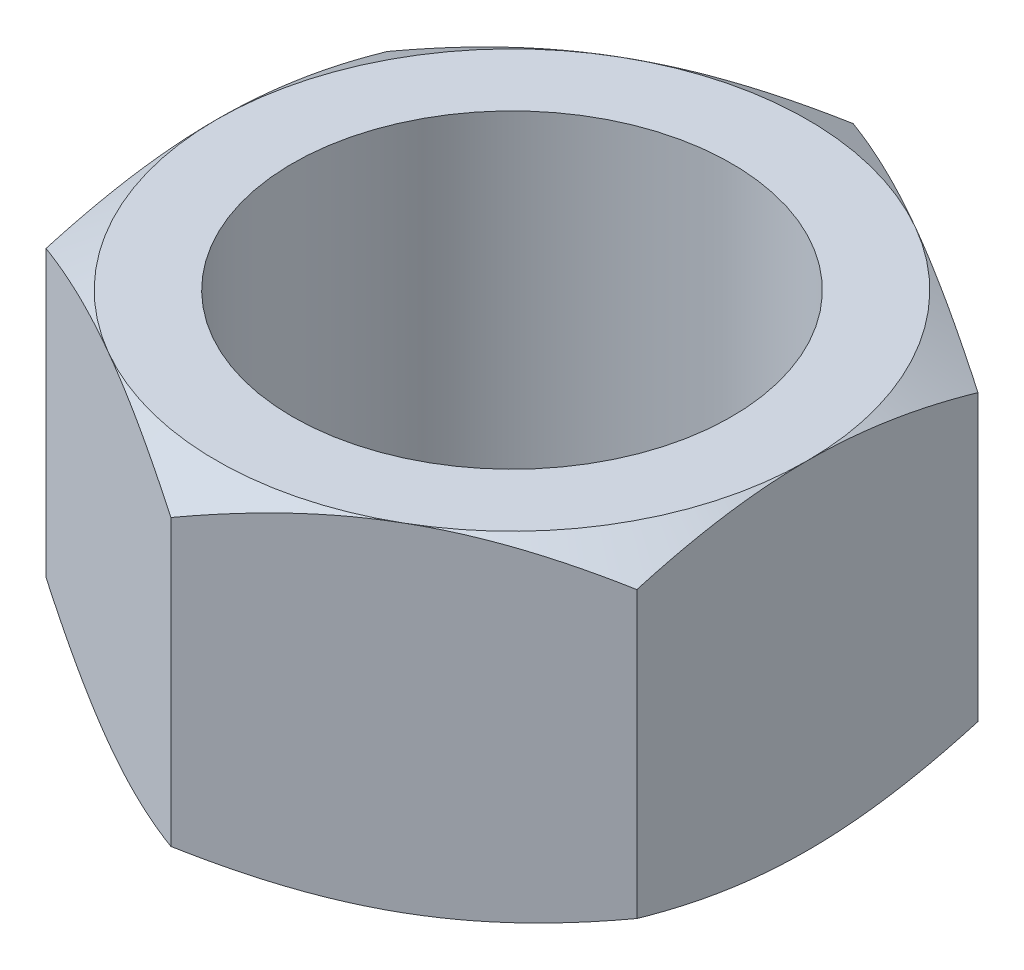
ISO-10303-21;
HEADER;
FILE_DESCRIPTION(('STEP AP214'),'2;1');
FILE_NAME('part.step','',(''),(''),'','','');
FILE_SCHEMA(('AUTOMOTIVE_DESIGN { 1 0 10303 214 1 1 1 1 }'));
ENDSEC;
DATA;
#1=APPLICATION_CONTEXT('core data for automotive mechanical design processes');
#2=APPLICATION_PROTOCOL_DEFINITION('international standard','automotive_design',2000,#1);
#3=PRODUCT_CONTEXT('',#1,'mechanical');
#4=PRODUCT('Part','Part','',(#3));
#5=PRODUCT_RELATED_PRODUCT_CATEGORY('part','',(#4));
#6=PRODUCT_DEFINITION_FORMATION('','',#4);
#7=PRODUCT_DEFINITION_CONTEXT('part definition',#1,'design');
#8=PRODUCT_DEFINITION('design','',#6,#7);
#9=PRODUCT_DEFINITION_SHAPE('','',#8);
#10=(LENGTH_UNIT() NAMED_UNIT(*) SI_UNIT(.MILLI.,.METRE.));
#11=(NAMED_UNIT(*) PLANE_ANGLE_UNIT() SI_UNIT($,.RADIAN.));
#12=(NAMED_UNIT(*) SI_UNIT($,.STERADIAN.) SOLID_ANGLE_UNIT());
#13=UNCERTAINTY_MEASURE_WITH_UNIT(LENGTH_MEASURE(1.E-05),#10,'distance_accuracy_value','');
#14=(GEOMETRIC_REPRESENTATION_CONTEXT(3) GLOBAL_UNCERTAINTY_ASSIGNED_CONTEXT((#13)) GLOBAL_UNIT_ASSIGNED_CONTEXT((#10,
#11,#12)) REPRESENTATION_CONTEXT('',''));
#15=CARTESIAN_POINT('',(0.,0.,0.));
#16=DIRECTION('',(0.,0.,1.));
#17=DIRECTION('',(1.,0.,0.));
#18=AXIS2_PLACEMENT_3D('',#15,#16,#17);
#19=CARTESIAN_POINT('',(4.44499999999997,2.54,-2.56632194654794));
#20=DIRECTION('',(-0.499999999999995,0.,0.866025403784441));
#21=DIRECTION('',(0.866025403784441,0.,0.499999999999995));
#22=AXIS2_PLACEMENT_3D('',#19,#20,#21);
#23=PLANE('',#22);
#24=CARTESIAN_POINT('',(-0.0002,-2.14292194429822,-5.13275936314961));
#25=CARTESIAN_POINT('',(0.195134205292003,-2.20805657093736,-5.01998310714234));
#26=CARTESIAN_POINT('',(0.39215452522148,-2.2672939412632,-4.90623337239523));
#27=CARTESIAN_POINT('',(0.789606715262491,-2.37069291144292,-4.67676424348505));
#28=CARTESIAN_POINT('',(0.990045647069465,-2.41481793333261,-4.56104077225021));
#29=CARTESIAN_POINT('',(1.38843947013211,-2.48350433724155,-4.33102799126151));
#30=CARTESIAN_POINT('',(1.58633306681894,-2.50852287412247,-4.21677406994347));
#31=CARTESIAN_POINT('',(1.98305132586114,-2.53838874032065,-3.98772867629302));
#32=CARTESIAN_POINT('',(2.18187454643839,-2.54326080228227,-3.8729380363716));
#33=CARTESIAN_POINT('',(2.55338076605085,-2.53312038077342,-3.65844882047272));
#34=CARTESIAN_POINT('',(2.72611940331296,-2.52059771326113,-3.55871812175));
#35=CARTESIAN_POINT('',(3.07047129711104,-2.48090971292823,-3.35990646316972));
#36=CARTESIAN_POINT('',(3.24208336277185,-2.45373082512862,-3.26082619086427));
#37=CARTESIAN_POINT('',(3.58714513426501,-2.38578630030974,-3.06160468420564));
#38=CARTESIAN_POINT('',(3.76055117129309,-2.34473267413266,-2.96148866204837));
#39=CARTESIAN_POINT('',(4.10477706620055,-2.25155731393392,-2.76274974896152));
#40=CARTESIAN_POINT('',(4.27560133346985,-2.19945747021142,-2.66412431226947));
#41=CARTESIAN_POINT('',(4.44519999999997,-2.14292194429822,-2.5662064764941));
#42=B_SPLINE_CURVE_WITH_KNOTS('',3,(#24,#25,#26,#27,#28,#29,#30,#31,#32,#33,#34,#35,#36,#37,#38,
#39,#40,#41),.UNSPECIFIED.,.F.,.F.,(4,2,2,2,2,2,2,2,4),(0.,0.704583898211653,1.41086131642101,
2.09965901433262,2.78761086425163,3.38660323540636,3.98615054427457,4.59899609230844,
5.21063832934908),.UNSPECIFIED.);
#43=CARTESIAN_POINT('',(0.,-2.14298861321455,-5.13264389309578));
#44=VERTEX_POINT('',#43);
#45=CARTESIAN_POINT('',(2.22249999999998,-2.54,-3.84948291982184));
#46=VERTEX_POINT('',#45);
#47=EDGE_CURVE('E64',#44,#46,#42,.T.);
#48=ORIENTED_EDGE('',*,*,#47,.F.);
#49=DIRECTION('',(0.,-1.,0.));
#50=VECTOR('',#49,1.);
#51=CARTESIAN_POINT('',(0.,2.54,-5.13264389309578));
#52=LINE('',#51,#50);
#53=CARTESIAN_POINT('',(0.,2.14298861321456,-5.13264389309578));
#54=VERTEX_POINT('',#53);
#55=EDGE_CURVE('E300',#54,#44,#52,.T.);
#56=ORIENTED_EDGE('',*,*,#55,.F.);
#57=CARTESIAN_POINT('',(4.44519999999997,2.14292194429822,-2.5662064764941));
#58=CARTESIAN_POINT('',(4.24986579470797,2.20805657093736,-2.67898273250138));
#59=CARTESIAN_POINT('',(4.05284547477849,2.2672939412632,-2.79273246724849));
#60=CARTESIAN_POINT('',(3.65539328473748,2.37069291144292,-3.02220159615867));
#61=CARTESIAN_POINT('',(3.45495435293051,2.41481793333261,-3.1379250673935));
#62=CARTESIAN_POINT('',(3.05656052986786,2.48350433724155,-3.36793784838221));
#63=CARTESIAN_POINT('',(2.85866693318103,2.50852287412248,-3.48219176970025));
#64=CARTESIAN_POINT('',(2.46194867413884,2.53838874032065,-3.71123716335069));
#65=CARTESIAN_POINT('',(2.26312545356158,2.54326080228227,-3.82602780327212));
#66=CARTESIAN_POINT('',(1.89161923394912,2.53312038077342,-4.04051701917099));
#67=CARTESIAN_POINT('',(1.71888059668701,2.52059771326113,-4.14024771789372));
#68=CARTESIAN_POINT('',(1.37452870288893,2.48090971292823,-4.339059376474));
#69=CARTESIAN_POINT('',(1.20291663722813,2.45373082512862,-4.43813964877945));
#70=CARTESIAN_POINT('',(0.857854865734964,2.38578630030974,-4.63736115543807));
#71=CARTESIAN_POINT('',(0.684448828706879,2.34473267413266,-4.73747717759534));
#72=CARTESIAN_POINT('',(0.340222933799419,2.25155731393392,-4.9362160906822));
#73=CARTESIAN_POINT('',(0.169398666530117,2.19945747021142,-5.03484152737425));
#74=CARTESIAN_POINT('',(-0.000199999999999549,2.14292194429822,-5.13275936314961));
#75=B_SPLINE_CURVE_WITH_KNOTS('',3,(#57,#58,#59,#60,#61,#62,#63,#64,#65,#66,#67,#68,#69,#70,#71,
#72,#73,#74),.UNSPECIFIED.,.F.,.F.,(4,2,2,2,2,2,2,2,4),(0.,0.704583898211653,1.41086131642101,
2.09965901433262,2.78761086425163,3.38660323540636,3.98615054427457,4.59899609230844,
5.21063832934908),.UNSPECIFIED.);
#76=CARTESIAN_POINT('',(2.22249999999999,2.54,-3.84948291982186));
#77=VERTEX_POINT('',#76);
#78=EDGE_CURVE('E270',#77,#54,#75,.T.);
#79=ORIENTED_EDGE('',*,*,#78,.F.);
#80=CARTESIAN_POINT('',(4.44499999999997,2.14298861321456,-2.56632194654794));
#81=VERTEX_POINT('',#80);
#82=EDGE_CURVE('E344',#81,#77,#75,.T.);
#83=ORIENTED_EDGE('',*,*,#82,.F.);
#84=DIRECTION('',(0.,-1.,0.));
#85=VECTOR('',#84,1.);
#86=CARTESIAN_POINT('',(4.44499999999997,2.54,-2.56632194654794));
#87=LINE('',#86,#85);
#88=CARTESIAN_POINT('',(4.44499999999997,-2.14298861321455,-2.56632194654794));
#89=VERTEX_POINT('',#88);
#90=EDGE_CURVE('E348',#81,#89,#87,.T.);
#91=ORIENTED_EDGE('',*,*,#90,.T.);
#92=EDGE_CURVE('E150',#46,#89,#42,.T.);
#93=ORIENTED_EDGE('',*,*,#92,.F.);
#94=EDGE_LOOP('',(#48,#56,#79,#83,#91,#93));
#95=FACE_BOUND('',#94,.T.);
#96=ADVANCED_FACE('F47',(#95),#23,.F.);
#97=CARTESIAN_POINT('',(0.,2.54,-5.13264389309578));
#98=DIRECTION('',(0.500000000000001,0.,0.866025403784438));
#99=DIRECTION('',(0.866025403784438,0.,-0.500000000000001));
#100=AXIS2_PLACEMENT_3D('',#97,#98,#99);
#101=PLANE('',#100);
#102=CARTESIAN_POINT('',(-4.44520000000001,-2.14292194429822,-2.56620647649404));
#103=CARTESIAN_POINT('',(-4.24986579470801,-2.20805657093736,-2.67898273250132));
#104=CARTESIAN_POINT('',(-4.05284547477853,-2.2672939412632,-2.79273246724843));
#105=CARTESIAN_POINT('',(-3.65539328473752,-2.37069291144292,-3.02220159615861));
#106=CARTESIAN_POINT('',(-3.45495435293055,-2.41481793333262,-3.13792506739345));
#107=CARTESIAN_POINT('',(-3.0565605298679,-2.48350433724155,-3.36793784838215));
#108=CARTESIAN_POINT('',(-2.85866693318107,-2.50852287412248,-3.4821917697002));
#109=CARTESIAN_POINT('',(-2.46194867413888,-2.53838874032066,-3.71123716335065));
#110=CARTESIAN_POINT('',(-2.26312545356163,-2.54326080228228,-3.82602780327207));
#111=CARTESIAN_POINT('',(-1.89161923394916,-2.53312038077343,-4.04051701917095));
#112=CARTESIAN_POINT('',(-1.71888059668705,-2.52059771326114,-4.14024771789368));
#113=CARTESIAN_POINT('',(-1.37452870288896,-2.48090971292824,-4.33905937647397));
#114=CARTESIAN_POINT('',(-1.20291663722815,-2.45373082512863,-4.43813964877942));
#115=CARTESIAN_POINT('',(-0.857854865734983,-2.38578630030975,-4.63736115543805));
#116=CARTESIAN_POINT('',(-0.684448828706893,-2.34473267413267,-4.73747717759533));
#117=CARTESIAN_POINT('',(-0.340222933799426,-2.25155731393393,-4.93621609068219));
#118=CARTESIAN_POINT('',(-0.169398666530121,-2.19945747021142,-5.03484152737425));
#119=CARTESIAN_POINT('',(0.000199999999999846,-2.14292194429822,-5.13275936314961));
#120=B_SPLINE_CURVE_WITH_KNOTS('',3,(#102,#103,#104,#105,#106,#107,#108,#109,#110,#111,#112,
#113,#114,#115,#116,#117,#118,#119),.UNSPECIFIED.,.F.,.F.,(4,2,2,2,2,2,2,2,4),(0.,
0.704583898211653,1.41086131642101,2.09965901433262,2.78761086425163,3.38660323540637,
3.9861505442746,4.59899609230849,5.21063832934914),.UNSPECIFIED.);
#121=CARTESIAN_POINT('',(-4.44500000000001,-2.14298861321455,-2.56632194654788));
#122=VERTEX_POINT('',#121);
#123=CARTESIAN_POINT('',(-2.2225,-2.54,-3.84948291982183));
#124=VERTEX_POINT('',#123);
#125=EDGE_CURVE('E72',#122,#124,#120,.T.);
#126=ORIENTED_EDGE('',*,*,#125,.F.);
#127=DIRECTION('',(0.,-1.,0.));
#128=VECTOR('',#127,1.);
#129=CARTESIAN_POINT('',(-4.44500000000001,2.54,-2.56632194654788));
#130=LINE('',#129,#128);
#131=CARTESIAN_POINT('',(-4.44500000000001,2.14298861321456,-2.56632194654788));
#132=VERTEX_POINT('',#131);
#133=EDGE_CURVE('E291',#132,#122,#130,.T.);
#134=ORIENTED_EDGE('',*,*,#133,.F.);
#135=CARTESIAN_POINT('',(0.000200000000000009,2.14292194429822,-5.13275936314961));
#136=CARTESIAN_POINT('',(-0.195134205292002,2.20805657093736,-5.01998310714234));
#137=CARTESIAN_POINT('',(-0.392154525221478,2.2672939412632,-4.90623337239523));
#138=CARTESIAN_POINT('',(-0.789606715262487,2.37069291144293,-4.67676424348504));
#139=CARTESIAN_POINT('',(-0.99004564706946,2.41481793333262,-4.5610407722502));
#140=CARTESIAN_POINT('',(-1.38843947013211,2.48350433724155,-4.3310279912615));
#141=CARTESIAN_POINT('',(-1.58633306681894,2.50852287412248,-4.21677406994346));
#142=CARTESIAN_POINT('',(-1.98305132586113,2.53838874032066,-3.98772867629301));
#143=CARTESIAN_POINT('',(-2.18187454643838,2.54326080228228,-3.87293803637158));
#144=CARTESIAN_POINT('',(-2.55338076605084,2.53312038077344,-3.6584488204727));
#145=CARTESIAN_POINT('',(-2.72611940331296,2.52059771326115,-3.55871812174997));
#146=CARTESIAN_POINT('',(-3.07047129711105,2.48090971292824,-3.35990646316969));
#147=CARTESIAN_POINT('',(-3.24208336277185,2.45373082512863,-3.26082619086423));
#148=CARTESIAN_POINT('',(-3.58714513426502,2.38578630030975,-3.0616046842056));
#149=CARTESIAN_POINT('',(-3.76055117129311,2.34473267413267,-2.96148866204833));
#150=CARTESIAN_POINT('',(-4.10477706620058,2.25155731393393,-2.76274974896146));
#151=CARTESIAN_POINT('',(-4.27560133346989,2.19945747021143,-2.66412431226941));
#152=CARTESIAN_POINT('',(-4.44520000000001,2.14292194429822,-2.56620647649404));
#153=B_SPLINE_CURVE_WITH_KNOTS('',3,(#135,#136,#137,#138,#139,#140,#141,#142,#143,#144,#145,
#146,#147,#148,#149,#150,#151,#152),.UNSPECIFIED.,.F.,.F.,(4,2,2,2,2,2,2,2,4),(0.,
0.704583898211653,1.41086131642101,2.09965901433262,2.78761086425163,3.38660323540637,
3.9861505442746,4.59899609230849,5.21063832934914),.UNSPECIFIED.);
#154=CARTESIAN_POINT('',(-2.22250000000001,2.54,-3.84948291982183));
#155=VERTEX_POINT('',#154);
#156=EDGE_CURVE('E262',#155,#132,#153,.T.);
#157=ORIENTED_EDGE('',*,*,#156,.F.);
#158=EDGE_CURVE('E269',#54,#155,#153,.T.);
#159=ORIENTED_EDGE('',*,*,#158,.F.);
#160=ORIENTED_EDGE('',*,*,#55,.T.);
#161=EDGE_CURVE('E177',#124,#44,#120,.T.);
#162=ORIENTED_EDGE('',*,*,#161,.F.);
#163=EDGE_LOOP('',(#126,#134,#157,#159,#160,#162));
#164=FACE_BOUND('',#163,.T.);
#165=ADVANCED_FACE('F276',(#164),#101,.F.);
#166=CARTESIAN_POINT('',(-4.44500000000001,2.54,-2.56632194654788));
#167=DIRECTION('',(1.,0.,0.));
#168=DIRECTION('',(0.,0.,-1.));
#169=AXIS2_PLACEMENT_3D('',#166,#167,#168);
#170=PLANE('',#169);
#171=CARTESIAN_POINT('',(-4.44499999999997,0.913793553764367,9.43225036305231));
#172=CARTESIAN_POINT('',(-4.44499999999997,0.799939464876857,9.21422222232649));
#173=CARTESIAN_POINT('',(-4.44499999999997,0.686627140735543,8.99590893694942));
#174=CARTESIAN_POINT('',(-4.44499999999997,0.461361050932911,8.55857151988885));
#175=CARTESIAN_POINT('',(-4.44499999999997,0.349407341607161,8.33954735920264));
#176=CARTESIAN_POINT('',(-4.44499999999997,0.126979863125517,7.9003435695982));
#177=CARTESIAN_POINT('',(-4.44499999999998,0.0165085071575138,7.68016271663265));
#178=CARTESIAN_POINT('',(-4.44499999999998,-0.202398705212406,7.23879398225194));
#179=CARTESIAN_POINT('',(-4.44499999999998,-0.310834590773044,7.01760611531904));
#180=CARTESIAN_POINT('',(-4.44499999999998,-0.531229787322068,6.56146713388194));
#181=CARTESIAN_POINT('',(-4.44499999999998,-0.643041856033312,6.32644469047433));
#182=CARTESIAN_POINT('',(-4.44499999999998,-0.863040494433211,5.85471049641598));
#183=CARTESIAN_POINT('',(-4.44499999999998,-0.971227149117539,5.61799878552715));
#184=CARTESIAN_POINT('',(-4.44499999999998,-1.18283489632335,5.14258317678226));
#185=CARTESIAN_POINT('',(-4.44499999999998,-1.28625830016106,4.90388031296646));
#186=CARTESIAN_POINT('',(-4.44499999999999,-1.48686883477101,4.42388087539127));
#187=CARTESIAN_POINT('',(-4.44499999999999,-1.58405654672986,4.18258454580586));
#188=CARTESIAN_POINT('',(-4.44499999999999,-1.78084193214056,3.66873426469667));
#189=CARTESIAN_POINT('',(-4.44499999999999,-1.8794239427643,3.39578596515785));
#190=CARTESIAN_POINT('',(-4.44499999999999,-2.06214356003189,2.84497498911751));
#191=CARTESIAN_POINT('',(-4.44499999999999,-2.1462788796667,2.56711154218044));
#192=CARTESIAN_POINT('',(-4.44499999999999,-2.29293585486918,2.0116862938217));
#193=CARTESIAN_POINT('',(-4.44499999999999,-2.35586873274095,1.73423723011392));
#194=CARTESIAN_POINT('',(-4.445,-2.43120349492402,1.31469921034627));
#195=CARTESIAN_POINT('',(-4.445,-2.45313637580591,1.17430713518012));
#196=CARTESIAN_POINT('',(-4.445,-2.48996434819672,0.892612224475861));
#197=CARTESIAN_POINT('',(-4.445,-2.50486063425895,0.751309547655693));
#198=CARTESIAN_POINT('',(-4.445,-2.52727959876194,0.465555537823025));
#199=CARTESIAN_POINT('',(-4.445,-2.53466480236686,0.321093292334108));
#200=CARTESIAN_POINT('',(-4.445,-2.54128879275954,0.0319812773758228));
#201=CARTESIAN_POINT('',(-4.445,-2.54052763417278,-0.112668490829607));
#202=CARTESIAN_POINT('',(-4.445,-2.53088783566023,-0.401713765202345));
#203=CARTESIAN_POINT('',(-4.445,-2.52200822574437,-0.546109238921059));
#204=CARTESIAN_POINT('',(-4.445,-2.49649313483877,-0.834198678180961));
#205=CARTESIAN_POINT('',(-4.445,-2.47985743787404,-0.9778926240749));
#206=CARTESIAN_POINT('',(-4.445,-2.41832310581975,-1.41360737399661));
#207=CARTESIAN_POINT('',(-4.44500000000001,-2.36204122384692,-1.70406586069355));
#208=CARTESIAN_POINT('',(-4.44500000000001,-2.2602209118653,-2.13546189272902));
#209=CARTESIAN_POINT('',(-4.44500000000001,-2.22336551212094,-2.27859390746489));
#210=CARTESIAN_POINT('',(-4.44500000000001,-2.14468169228813,-2.56349565803153));
#211=CARTESIAN_POINT('',(-4.44500000000001,-2.1028532671832,-2.70526539248796));
#212=CARTESIAN_POINT('',(-4.44500000000001,-1.9663632861532,-3.14371334498779));
#213=CARTESIAN_POINT('',(-4.44500000000001,-1.86447604841242,-3.43813571248944));
#214=CARTESIAN_POINT('',(-4.44500000000001,-1.64771207452743,-4.022174103576));
#215=CARTESIAN_POINT('',(-4.44500000000001,-1.53283050448568,-4.31178829226816));
#216=CARTESIAN_POINT('',(-4.44500000000002,-1.29375704778267,-4.8876347742215));
#217=CARTESIAN_POINT('',(-4.44500000000002,-1.16955132017274,-5.17386127941992));
#218=CARTESIAN_POINT('',(-4.44500000000002,-0.914606930430404,-5.74331493687457));
#219=CARTESIAN_POINT('',(-4.44500000000002,-0.783869290415,-6.026542550045));
#220=CARTESIAN_POINT('',(-4.44500000000002,-0.526196668351576,-6.57249307029257));
#221=CARTESIAN_POINT('',(-4.44500000000002,-0.399561917038164,-6.83535826659629));
#222=CARTESIAN_POINT('',(-4.44500000000002,-0.143078804329942,-7.3595275738561));
#223=CARTESIAN_POINT('',(-4.44500000000002,-0.0132302933758102,-7.62083161145514));
#224=CARTESIAN_POINT('',(-4.44500000000003,0.248386588974361,-8.14106821825075));
#225=CARTESIAN_POINT('',(-4.44500000000003,0.380144316428684,-8.40000615273975));
#226=CARTESIAN_POINT('',(-4.44500000000003,0.645618837036986,-8.91684341347258));
#227=CARTESIAN_POINT('',(-4.44500000000003,0.77933543029397,-9.17474284231576));
#228=CARTESIAN_POINT('',(-4.44500000000003,0.913793553764366,-9.43225036305228));
#229=B_SPLINE_CURVE_WITH_KNOTS('',3,(#171,#172,#173,#174,#175,#176,#177,#178,#179,#180,#181,
#182,#183,#184,#185,#186,#187,#188,#189,#190,#191,#192,#193,#194,#195,#196,#197,#198,#199,#200,
#201,#202,#203,#204,#205,#206,#207,#208,#209,#210,#211,#212,#213,#214,#215,#216,#217,#218,#219,
#220,#221,#222,#223,#224,#225,#226,#227,#228),.UNSPECIFIED.,.F.,.F.,(4,2,2,2,2,2,2,2,2,2,2,2,2,
2,2,2,2,2,2,2,2,2,2,2,2,2,2,2,4),(0.,0.737898670351123,1.47582783416407,2.21484002208094,
2.95384161533626,3.73461045483919,4.51536097685688,5.29572856811454,6.07602332062079,
6.94634491301855,7.81680415644895,8.66925110589245,9.09538659456247,9.52144971518079,
9.95517785135082,10.3889030791563,10.8226801350915,11.2564692706476,12.1425569444736,
12.5859066800292,13.0292568628128,13.9634179036872,14.8979276029344,15.8338530320361,
16.7696324629604,17.6449395741667,18.5202874965781,19.3918749857373,20.263374142887),.UNSPECIFIED.);
#230=CARTESIAN_POINT('',(-4.44499999999999,-2.14298861321455,2.56632194654791));
#231=VERTEX_POINT('',#230);
#232=CARTESIAN_POINT('',(-4.445,-2.54,0.));
#233=VERTEX_POINT('',#232);
#234=EDGE_CURVE('E382',#231,#233,#229,.T.);
#235=ORIENTED_EDGE('',*,*,#234,.F.);
#236=DIRECTION('',(0.,-1.,0.));
#237=VECTOR('',#236,1.);
#238=CARTESIAN_POINT('',(-4.44499999999999,2.54,2.56632194654791));
#239=LINE('',#238,#237);
#240=CARTESIAN_POINT('',(-4.44499999999999,2.14298861321456,2.56632194654791));
#241=VERTEX_POINT('',#240);
#242=EDGE_CURVE('E301',#241,#231,#239,.T.);
#243=ORIENTED_EDGE('',*,*,#242,.F.);
#244=CARTESIAN_POINT('',(-4.44500000000003,-0.913793553764364,-9.43225036305228));
#245=CARTESIAN_POINT('',(-4.44500000000003,-0.799939464876854,-9.21422222232646));
#246=CARTESIAN_POINT('',(-4.44500000000003,-0.68662714073554,-8.99590893694939));
#247=CARTESIAN_POINT('',(-4.44500000000003,-0.461361050932909,-8.55857151988882));
#248=CARTESIAN_POINT('',(-4.44500000000003,-0.34940734160716,-8.33954735920261));
#249=CARTESIAN_POINT('',(-4.44500000000003,-0.126979863125515,-7.90034356959817));
#250=CARTESIAN_POINT('',(-4.44500000000002,-0.0165085071575114,-7.68016271663262));
#251=CARTESIAN_POINT('',(-4.44500000000002,0.202398705212409,-7.23879398225191));
#252=CARTESIAN_POINT('',(-4.44500000000002,0.310834590773046,-7.01760611531901));
#253=CARTESIAN_POINT('',(-4.44500000000002,0.53122978732207,-6.56146713388191));
#254=CARTESIAN_POINT('',(-4.44500000000002,0.643041856033314,-6.32644469047431));
#255=CARTESIAN_POINT('',(-4.44500000000002,0.863040494433212,-5.85471049641596));
#256=CARTESIAN_POINT('',(-4.44500000000002,0.97122714911754,-5.61799878552712));
#257=CARTESIAN_POINT('',(-4.44500000000002,1.18283489632335,-5.14258317678223));
#258=CARTESIAN_POINT('',(-4.44500000000002,1.28625830016107,-4.90388031296643));
#259=CARTESIAN_POINT('',(-4.44500000000001,1.48686883477102,-4.42388087539124));
#260=CARTESIAN_POINT('',(-4.44500000000001,1.58405654672986,-4.18258454580584));
#261=CARTESIAN_POINT('',(-4.44500000000001,1.78084193214057,-3.66873426469665));
#262=CARTESIAN_POINT('',(-4.44500000000001,1.87942394276431,-3.39578596515782));
#263=CARTESIAN_POINT('',(-4.44500000000001,2.0621435600319,-2.84497498911748));
#264=CARTESIAN_POINT('',(-4.44500000000001,2.1462788796667,-2.56711154218041));
#265=CARTESIAN_POINT('',(-4.44500000000001,2.29293585486918,-2.01168629382167));
#266=CARTESIAN_POINT('',(-4.44500000000001,2.35586873274095,-1.73423723011389));
#267=CARTESIAN_POINT('',(-4.445,2.43120349492403,-1.31469921034625));
#268=CARTESIAN_POINT('',(-4.445,2.45313637580591,-1.1743071351801));
#269=CARTESIAN_POINT('',(-4.445,2.48996434819672,-0.892612224475835));
#270=CARTESIAN_POINT('',(-4.445,2.50486063425895,-0.751309547655666));
#271=CARTESIAN_POINT('',(-4.445,2.52727959876194,-0.465555537822997));
#272=CARTESIAN_POINT('',(-4.445,2.53466480236686,-0.32109329233408));
#273=CARTESIAN_POINT('',(-4.445,2.54128879275954,-0.031981277375795));
#274=CARTESIAN_POINT('',(-4.445,2.54052763417279,0.112668490829635));
#275=CARTESIAN_POINT('',(-4.445,2.53088783566023,0.401713765202373));
#276=CARTESIAN_POINT('',(-4.445,2.52200822574438,0.546109238921087));
#277=CARTESIAN_POINT('',(-4.445,2.49649313483878,0.834198678180989));
#278=CARTESIAN_POINT('',(-4.445,2.47985743787404,0.977892624074928));
#279=CARTESIAN_POINT('',(-4.44499999999999,2.41832310581975,1.41360737399664));
#280=CARTESIAN_POINT('',(-4.44499999999999,2.36204122384692,1.70406586069358));
#281=CARTESIAN_POINT('',(-4.44499999999999,2.2602209118653,2.13546189272905));
#282=CARTESIAN_POINT('',(-4.44499999999999,2.22336551212094,2.27859390746492));
#283=CARTESIAN_POINT('',(-4.44499999999999,2.14468169228814,2.56349565803156));
#284=CARTESIAN_POINT('',(-4.44499999999999,2.1028532671832,2.70526539248799));
#285=CARTESIAN_POINT('',(-4.44499999999999,1.96636328615321,3.14371334498782));
#286=CARTESIAN_POINT('',(-4.44499999999999,1.86447604841243,3.43813571248946));
#287=CARTESIAN_POINT('',(-4.44499999999999,1.64771207452743,4.02217410357603));
#288=CARTESIAN_POINT('',(-4.44499999999999,1.53283050448568,4.31178829226819));
#289=CARTESIAN_POINT('',(-4.44499999999998,1.29375704778267,4.88763477422153));
#290=CARTESIAN_POINT('',(-4.44499999999998,1.16955132017274,5.17386127941996));
#291=CARTESIAN_POINT('',(-4.44499999999998,0.914606930430404,5.74331493687461));
#292=CARTESIAN_POINT('',(-4.44499999999998,0.783869290414999,6.02654255004504));
#293=CARTESIAN_POINT('',(-4.44499999999998,0.526196668351574,6.5724930702926));
#294=CARTESIAN_POINT('',(-4.44499999999998,0.399561917038163,6.83535826659632));
#295=CARTESIAN_POINT('',(-4.44499999999998,0.14307880432994,7.35952757385614));
#296=CARTESIAN_POINT('',(-4.44499999999998,0.0132302933758075,7.62083161145518));
#297=CARTESIAN_POINT('',(-4.44499999999997,-0.248386588974364,8.14106821825079));
#298=CARTESIAN_POINT('',(-4.44499999999997,-0.380144316428687,8.40000615273979));
#299=CARTESIAN_POINT('',(-4.44499999999997,-0.645618837036988,8.91684341347261));
#300=CARTESIAN_POINT('',(-4.44499999999997,-0.779335430293971,9.17474284231579));
#301=CARTESIAN_POINT('',(-4.44499999999997,-0.913793553764365,9.43225036305231));
#302=B_SPLINE_CURVE_WITH_KNOTS('',3,(#244,#245,#246,#247,#248,#249,#250,#251,#252,#253,#254,
#255,#256,#257,#258,#259,#260,#261,#262,#263,#264,#265,#266,#267,#268,#269,#270,#271,#272,#273,
#274,#275,#276,#277,#278,#279,#280,#281,#282,#283,#284,#285,#286,#287,#288,#289,#290,#291,#292,
#293,#294,#295,#296,#297,#298,#299,#300,#301),.UNSPECIFIED.,.F.,.F.,(4,2,2,2,2,2,2,2,2,2,2,2,2,
2,2,2,2,2,2,2,2,2,2,2,2,2,2,2,4),(0.,0.737898670351122,1.47582783416407,2.21484002208093,
2.95384161533626,3.73461045483918,4.51536097685688,5.29572856811453,6.07602332062079,
6.94634491301855,7.81680415644895,8.66925110589245,9.09538659456246,9.52144971518079,
9.95517785135082,10.3889030791563,10.8226801350915,11.2564692706476,12.1425569444736,
12.5859066800292,13.0292568628128,13.9634179036872,14.8979276029344,15.8338530320361,
16.7696324629604,17.6449395741668,18.5202874965781,19.3918749857373,20.263374142887),.UNSPECIFIED.);
#303=CARTESIAN_POINT('',(-4.445,2.54,0.));
#304=VERTEX_POINT('',#303);
#305=EDGE_CURVE('E254',#304,#241,#302,.T.);
#306=ORIENTED_EDGE('',*,*,#305,.F.);
#307=EDGE_CURVE('E261',#132,#304,#302,.T.);
#308=ORIENTED_EDGE('',*,*,#307,.F.);
#309=ORIENTED_EDGE('',*,*,#133,.T.);
#310=EDGE_CURVE('E212',#233,#122,#229,.T.);
#311=ORIENTED_EDGE('',*,*,#310,.F.);
#312=EDGE_LOOP('',(#235,#243,#306,#308,#309,#311));
#313=FACE_BOUND('',#312,.T.);
#314=ADVANCED_FACE('F234',(#313),#170,.F.);
#315=CARTESIAN_POINT('',(-4.44499999999999,2.54,2.56632194654791));
#316=DIRECTION('',(0.499999999999995,0.,-0.866025403784441));
#317=DIRECTION('',(-0.866025403784442,0.,-0.499999999999995));
#318=AXIS2_PLACEMENT_3D('',#315,#316,#317);
#319=PLANE('',#318);
#320=CARTESIAN_POINT('',(0.000200000000035841,-2.14292194429822,5.13275936314961));
#321=CARTESIAN_POINT('',(-0.195134205291967,-2.20805657093736,5.01998310714234));
#322=CARTESIAN_POINT('',(-0.392154525221444,-2.2672939412632,4.90623337239523));
#323=CARTESIAN_POINT('',(-0.789606715262454,-2.37069291144292,4.67676424348505));
#324=CARTESIAN_POINT('',(-0.990045647069428,-2.41481793333262,4.56104077225021));
#325=CARTESIAN_POINT('',(-1.38843947013208,-2.48350433724155,4.33102799126151));
#326=CARTESIAN_POINT('',(-1.58633306681891,-2.50852287412248,4.21677406994347));
#327=CARTESIAN_POINT('',(-1.9830513258611,-2.53838874032066,3.98772867629302));
#328=CARTESIAN_POINT('',(-2.18187454643835,-2.54326080228228,3.8729380363716));
#329=CARTESIAN_POINT('',(-2.55338076605082,-2.53312038077343,3.65844882047272));
#330=CARTESIAN_POINT('',(-2.72611940331293,-2.52059771326114,3.55871812174999));
#331=CARTESIAN_POINT('',(-3.07047129711103,-2.48090971292824,3.35990646316971));
#332=CARTESIAN_POINT('',(-3.24208336277183,-2.45373082512863,3.26082619086426));
#333=CARTESIAN_POINT('',(-3.587145134265,-2.38578630030975,3.06160468420563));
#334=CARTESIAN_POINT('',(-3.76055117129309,-2.34473267413267,2.96148866204835));
#335=CARTESIAN_POINT('',(-4.10477706620056,-2.25155731393393,2.76274974896149));
#336=CARTESIAN_POINT('',(-4.27560133346987,-2.19945747021142,2.66412431226944));
#337=CARTESIAN_POINT('',(-4.44519999999999,-2.14292194429822,2.56620647649407));
#338=B_SPLINE_CURVE_WITH_KNOTS('',3,(#320,#321,#322,#323,#324,#325,#326,#327,#328,#329,#330,
#331,#332,#333,#334,#335,#336,#337),.UNSPECIFIED.,.F.,.F.,(4,2,2,2,2,2,2,2,4),(0.,
0.704583898211653,1.41086131642101,2.09965901433262,2.78761086425163,3.38660323540637,
3.9861505442746,4.59899609230849,5.21063832934915),.UNSPECIFIED.);
#339=CARTESIAN_POINT('',(0.,-2.14298861321455,5.13264389309577));
#340=VERTEX_POINT('',#339);
#341=CARTESIAN_POINT('',(-2.22249999999998,-2.54,3.84948291982184));
#342=VERTEX_POINT('',#341);
#343=EDGE_CURVE('E159',#340,#342,#338,.T.);
#344=ORIENTED_EDGE('',*,*,#343,.F.);
#345=DIRECTION('',(0.,-1.,0.));
#346=VECTOR('',#345,1.);
#347=CARTESIAN_POINT('',(0.,2.54,5.13264389309577));
#348=LINE('',#347,#346);
#349=CARTESIAN_POINT('',(0.,2.14298861321456,5.13264389309577));
#350=VERTEX_POINT('',#349);
#351=EDGE_CURVE('E173',#350,#340,#348,.T.);
#352=ORIENTED_EDGE('',*,*,#351,.F.);
#353=CARTESIAN_POINT('',(-4.44519999999999,2.14292194429822,2.56620647649407));
#354=CARTESIAN_POINT('',(-4.24986579470799,2.20805657093736,2.67898273250135));
#355=CARTESIAN_POINT('',(-4.05284547477851,2.2672939412632,2.79273246724846));
#356=CARTESIAN_POINT('',(-3.6553932847375,2.37069291144293,3.02220159615864));
#357=CARTESIAN_POINT('',(-3.45495435293053,2.41481793333262,3.13792506739347));
#358=CARTESIAN_POINT('',(-3.05656052986788,2.48350433724155,3.36793784838218));
#359=CARTESIAN_POINT('',(-2.85866693318105,2.50852287412248,3.48219176970022));
#360=CARTESIAN_POINT('',(-2.46194867413886,2.53838874032066,3.71123716335066));
#361=CARTESIAN_POINT('',(-2.2631254535616,2.54326080228228,3.82602780327209));
#362=CARTESIAN_POINT('',(-1.89161923394914,2.53312038077344,4.04051701917096));
#363=CARTESIAN_POINT('',(-1.71888059668702,2.52059771326115,4.14024771789369));
#364=CARTESIAN_POINT('',(-1.37452870288893,2.48090971292824,4.33905937647398));
#365=CARTESIAN_POINT('',(-1.20291663722812,2.45373082512863,4.43813964877943));
#366=CARTESIAN_POINT('',(-0.857854865734951,2.38578630030975,4.63736115543806));
#367=CARTESIAN_POINT('',(-0.684448828706862,2.34473267413267,4.73747717759533));
#368=CARTESIAN_POINT('',(-0.340222933799393,2.25155731393393,4.9362160906822));
#369=CARTESIAN_POINT('',(-0.169398666530086,2.19945747021143,5.03484152737425));
#370=CARTESIAN_POINT('',(0.000200000000035533,2.14292194429822,5.13275936314961));
#371=B_SPLINE_CURVE_WITH_KNOTS('',3,(#353,#354,#355,#356,#357,#358,#359,#360,#361,#362,#363,
#364,#365,#366,#367,#368,#369,#370),.UNSPECIFIED.,.F.,.F.,(4,2,2,2,2,2,2,2,4),(0.,
0.704583898211653,1.41086131642101,2.09965901433262,2.78761086425163,3.38660323540637,
3.9861505442746,4.59899609230849,5.21063832934915),.UNSPECIFIED.);
#372=CARTESIAN_POINT('',(-2.22249999999998,2.54,3.84948291982184));
#373=VERTEX_POINT('',#372);
#374=EDGE_CURVE('E239',#373,#350,#371,.T.);
#375=ORIENTED_EDGE('',*,*,#374,.F.);
#376=EDGE_CURVE('E247',#241,#373,#371,.T.);
#377=ORIENTED_EDGE('',*,*,#376,.F.);
#378=ORIENTED_EDGE('',*,*,#242,.T.);
#379=EDGE_CURVE('E179',#342,#231,#338,.T.);
#380=ORIENTED_EDGE('',*,*,#379,.F.);
#381=EDGE_LOOP('',(#344,#352,#375,#377,#378,#380));
#382=FACE_BOUND('',#381,.T.);
#383=ADVANCED_FACE('F231',(#382),#319,.F.);
#384=CARTESIAN_POINT('',(0.,2.54,5.13264389309577));
#385=DIRECTION('',(-0.500000000000007,0.,-0.866025403784435));
#386=DIRECTION('',(-0.866025403784435,0.,0.500000000000007));
#387=AXIS2_PLACEMENT_3D('',#384,#385,#386);
#388=PLANE('',#387);
#389=CARTESIAN_POINT('',(4.44520000000003,-2.14292194429822,2.56620647649401));
#390=CARTESIAN_POINT('',(4.24986579470802,-2.20805657093736,2.67898273250129));
#391=CARTESIAN_POINT('',(4.05284547477855,-2.2672939412632,2.7927324672484));
#392=CARTESIAN_POINT('',(3.65539328473754,-2.37069291144292,3.02220159615859));
#393=CARTESIAN_POINT('',(3.45495435293057,-2.41481793333262,3.13792506739343));
#394=CARTESIAN_POINT('',(3.05656052986792,-2.48350433724155,3.36793784838213));
#395=CARTESIAN_POINT('',(2.8586669331811,-2.50852287412248,3.48219176970018));
#396=CARTESIAN_POINT('',(2.46194867413891,-2.53838874032066,3.71123716335063));
#397=CARTESIAN_POINT('',(2.26312545356166,-2.54326080228228,3.82602780327206));
#398=CARTESIAN_POINT('',(1.89161923394919,-2.53312038077343,4.04051701917094));
#399=CARTESIAN_POINT('',(1.71888059668708,-2.52059771326114,4.14024771789367));
#400=CARTESIAN_POINT('',(1.37452870288899,-2.48090971292824,4.33905937647396));
#401=CARTESIAN_POINT('',(1.20291663722818,-2.45373082512863,4.43813964877941));
#402=CARTESIAN_POINT('',(0.857854865735015,-2.38578630030975,4.63736115543805));
#403=CARTESIAN_POINT('',(0.684448828706927,-2.34473267413267,4.73747717759532));
#404=CARTESIAN_POINT('',(0.340222933799461,-2.25155731393393,4.93621609068219));
#405=CARTESIAN_POINT('',(0.169398666530156,-2.19945747021142,5.03484152737424));
#406=CARTESIAN_POINT('',(-0.000199999999963942,-2.14292194429822,5.13275936314961));
#407=B_SPLINE_CURVE_WITH_KNOTS('',3,(#389,#390,#391,#392,#393,#394,#395,#396,#397,#398,#399,
#400,#401,#402,#403,#404,#405,#406),.UNSPECIFIED.,.F.,.F.,(4,2,2,2,2,2,2,2,4),(0.,
0.704583898211653,1.41086131642101,2.09965901433262,2.78761086425163,3.38660323540637,
3.9861505442746,4.59899609230849,5.21063832934914),.UNSPECIFIED.);
#408=CARTESIAN_POINT('',(4.44500000000003,-2.14298861321455,2.56632194654785));
#409=VERTEX_POINT('',#408);
#410=CARTESIAN_POINT('',(2.22250000000003,-2.54,3.84948291982181));
#411=VERTEX_POINT('',#410);
#412=EDGE_CURVE('E138',#409,#411,#407,.T.);
#413=ORIENTED_EDGE('',*,*,#412,.F.);
#414=DIRECTION('',(0.,-1.,0.));
#415=VECTOR('',#414,1.);
#416=CARTESIAN_POINT('',(4.44500000000003,2.54,2.56632194654785));
#417=LINE('',#416,#415);
#418=CARTESIAN_POINT('',(4.44500000000003,2.14298861321456,2.56632194654785));
#419=VERTEX_POINT('',#418);
#420=EDGE_CURVE('E354',#419,#409,#417,.T.);
#421=ORIENTED_EDGE('',*,*,#420,.F.);
#422=CARTESIAN_POINT('',(-0.000199999999964182,2.14292194429822,5.13275936314961));
#423=CARTESIAN_POINT('',(0.195134205292037,2.20805657093736,5.01998310714233));
#424=CARTESIAN_POINT('',(0.392154525221512,2.2672939412632,4.90623337239522));
#425=CARTESIAN_POINT('',(0.789606715262519,2.37069291144293,4.67676424348504));
#426=CARTESIAN_POINT('',(0.990045647069491,2.41481793333262,4.5610407722502));
#427=CARTESIAN_POINT('',(1.38843947013214,2.48350433724155,4.33102799126149));
#428=CARTESIAN_POINT('',(1.58633306681897,2.50852287412248,4.21677406994345));
#429=CARTESIAN_POINT('',(1.98305132586115,2.53838874032066,3.98772867629299));
#430=CARTESIAN_POINT('',(2.18187454643841,2.54326080228228,3.87293803637157));
#431=CARTESIAN_POINT('',(2.55338076605087,2.53312038077344,3.65844882047269));
#432=CARTESIAN_POINT('',(2.72611940331298,2.52059771326115,3.55871812174996));
#433=CARTESIAN_POINT('',(3.07047129711107,2.48090971292824,3.35990646316967));
#434=CARTESIAN_POINT('',(3.24208336277188,2.45373082512863,3.26082619086421));
#435=CARTESIAN_POINT('',(3.58714513426505,2.38578630030975,3.06160468420558));
#436=CARTESIAN_POINT('',(3.76055117129314,2.34473267413267,2.9614886620483));
#437=CARTESIAN_POINT('',(4.1047770662006,2.25155731393393,2.76274974896143));
#438=CARTESIAN_POINT('',(4.27560133346991,2.19945747021143,2.66412431226938));
#439=CARTESIAN_POINT('',(4.44520000000003,2.14292194429822,2.56620647649401));
#440=B_SPLINE_CURVE_WITH_KNOTS('',3,(#422,#423,#424,#425,#426,#427,#428,#429,#430,#431,#432,
#433,#434,#435,#436,#437,#438,#439),.UNSPECIFIED.,.F.,.F.,(4,2,2,2,2,2,2,2,4),(0.,
0.704583898211652,1.41086131642101,2.09965901433262,2.78761086425163,3.38660323540637,
3.9861505442746,4.59899609230849,5.21063832934915),.UNSPECIFIED.);
#441=CARTESIAN_POINT('',(2.22250000000003,2.54,3.84948291982181));
#442=VERTEX_POINT('',#441);
#443=EDGE_CURVE('E249',#442,#419,#440,.T.);
#444=ORIENTED_EDGE('',*,*,#443,.F.);
#445=EDGE_CURVE('E248',#350,#442,#440,.T.);
#446=ORIENTED_EDGE('',*,*,#445,.F.);
#447=ORIENTED_EDGE('',*,*,#351,.T.);
#448=EDGE_CURVE('E153',#411,#340,#407,.T.);
#449=ORIENTED_EDGE('',*,*,#448,.F.);
#450=EDGE_LOOP('',(#413,#421,#444,#446,#447,#449));
#451=FACE_BOUND('',#450,.T.);
#452=ADVANCED_FACE('F170',(#451),#388,.F.);
#453=CARTESIAN_POINT('',(4.44500000000003,2.54,2.56632194654785));
#454=DIRECTION('',(-1.,0.,0.));
#455=DIRECTION('',(0.,0.,1.));
#456=AXIS2_PLACEMENT_3D('',#453,#454,#455);
#457=PLANE('',#456);
#458=CARTESIAN_POINT('',(4.4449999999999,0.913793553764365,-9.43225036305234));
#459=CARTESIAN_POINT('',(4.4449999999999,0.799939464876856,-9.21422222232652));
#460=CARTESIAN_POINT('',(4.4449999999999,0.686627140735542,-8.99590893694945));
#461=CARTESIAN_POINT('',(4.44499999999991,0.461361050932911,-8.55857151988888));
#462=CARTESIAN_POINT('',(4.44499999999991,0.349407341607161,-8.33954735920267));
#463=CARTESIAN_POINT('',(4.44499999999992,0.126979863125517,-7.90034356959823));
#464=CARTESIAN_POINT('',(4.44499999999992,0.0165085071575133,-7.68016271663268));
#465=CARTESIAN_POINT('',(4.44499999999992,-0.202398705212406,-7.23879398225197));
#466=CARTESIAN_POINT('',(4.44499999999993,-0.310834590773043,-7.01760611531907));
#467=CARTESIAN_POINT('',(4.44499999999993,-0.531229787322067,-6.56146713388197));
#468=CARTESIAN_POINT('',(4.44499999999993,-0.643041856033313,-6.32644469047437));
#469=CARTESIAN_POINT('',(4.44499999999994,-0.863040494433211,-5.85471049641601));
#470=CARTESIAN_POINT('',(4.44499999999994,-0.971227149117539,-5.61799878552718));
#471=CARTESIAN_POINT('',(4.44499999999995,-1.18283489632335,-5.14258317678229));
#472=CARTESIAN_POINT('',(4.44499999999995,-1.28625830016106,-4.90388031296649));
#473=CARTESIAN_POINT('',(4.44499999999995,-1.48686883477101,-4.4238808753913));
#474=CARTESIAN_POINT('',(4.44499999999995,-1.58405654672986,-4.1825845458059));
#475=CARTESIAN_POINT('',(4.44499999999996,-1.78084193214056,-3.66873426469671));
#476=CARTESIAN_POINT('',(4.44499999999996,-1.8794239427643,-3.39578596515789));
#477=CARTESIAN_POINT('',(4.44499999999997,-2.06214356003189,-2.84497498911754));
#478=CARTESIAN_POINT('',(4.44499999999997,-2.1462788796667,-2.56711154218047));
#479=CARTESIAN_POINT('',(4.44499999999998,-2.29293585486918,-2.01168629382174));
#480=CARTESIAN_POINT('',(4.44499999999998,-2.35586873274095,-1.73423723011395));
#481=CARTESIAN_POINT('',(4.44499999999999,-2.43120349492402,-1.31469921034631));
#482=CARTESIAN_POINT('',(4.44499999999999,-2.45313637580591,-1.17430713518016));
#483=CARTESIAN_POINT('',(4.44499999999999,-2.48996434819672,-0.892612224475897));
#484=CARTESIAN_POINT('',(4.44499999999999,-2.50486063425895,-0.751309547655729));
#485=CARTESIAN_POINT('',(4.44499999999999,-2.52727959876194,-0.465555537823061));
#486=CARTESIAN_POINT('',(4.445,-2.53466480236686,-0.321093292334144));
#487=CARTESIAN_POINT('',(4.445,-2.54128879275954,-0.031981277375858));
#488=CARTESIAN_POINT('',(4.445,-2.54052763417278,0.112668490829573));
#489=CARTESIAN_POINT('',(4.445,-2.53088783566023,0.40171376520231));
#490=CARTESIAN_POINT('',(4.445,-2.52200822574438,0.546109238921024));
#491=CARTESIAN_POINT('',(4.44500000000001,-2.49649313483878,0.834198678180926));
#492=CARTESIAN_POINT('',(4.44500000000001,-2.47985743787404,0.977892624074865));
#493=CARTESIAN_POINT('',(4.44500000000001,-2.41832310581975,1.41360737399658));
#494=CARTESIAN_POINT('',(4.44500000000002,-2.36204122384692,1.70406586069351));
#495=CARTESIAN_POINT('',(4.44500000000002,-2.2602209118653,2.13546189272899));
#496=CARTESIAN_POINT('',(4.44500000000002,-2.22336551212094,2.27859390746486));
#497=CARTESIAN_POINT('',(4.44500000000003,-2.14468169228814,2.56349565803149));
#498=CARTESIAN_POINT('',(4.44500000000003,-2.1028532671832,2.70526539248792));
#499=CARTESIAN_POINT('',(4.44500000000003,-1.96636328615321,3.14371334498776));
#500=CARTESIAN_POINT('',(4.44500000000003,-1.86447604841242,3.4381357124894));
#501=CARTESIAN_POINT('',(4.44500000000004,-1.64771207452743,4.02217410357596));
#502=CARTESIAN_POINT('',(4.44500000000004,-1.53283050448568,4.31178829226813));
#503=CARTESIAN_POINT('',(4.44500000000005,-1.29375704778267,4.88763477422147));
#504=CARTESIAN_POINT('',(4.44500000000005,-1.16955132017273,5.1738612794199));
#505=CARTESIAN_POINT('',(4.44500000000006,-0.914606930430402,5.74331493687455));
#506=CARTESIAN_POINT('',(4.44500000000006,-0.783869290414998,6.02654255004497));
#507=CARTESIAN_POINT('',(4.44500000000007,-0.526196668351573,6.57249307029254));
#508=CARTESIAN_POINT('',(4.44500000000007,-0.399561917038162,6.83535826659626));
#509=CARTESIAN_POINT('',(4.44500000000008,-0.143078804329939,7.35952757385608));
#510=CARTESIAN_POINT('',(4.44500000000008,-0.0132302933758071,7.62083161145511));
#511=CARTESIAN_POINT('',(4.44500000000008,0.248386588974363,8.14106821825073));
#512=CARTESIAN_POINT('',(4.44500000000009,0.380144316428687,8.40000615273972));
#513=CARTESIAN_POINT('',(4.44500000000009,0.645618837036989,8.91684341347255));
#514=CARTESIAN_POINT('',(4.4450000000001,0.779335430293972,9.17474284231573));
#515=CARTESIAN_POINT('',(4.4450000000001,0.913793553764367,9.43225036305225));
#516=B_SPLINE_CURVE_WITH_KNOTS('',3,(#458,#459,#460,#461,#462,#463,#464,#465,#466,#467,#468,
#469,#470,#471,#472,#473,#474,#475,#476,#477,#478,#479,#480,#481,#482,#483,#484,#485,#486,#487,
#488,#489,#490,#491,#492,#493,#494,#495,#496,#497,#498,#499,#500,#501,#502,#503,#504,#505,#506,
#507,#508,#509,#510,#511,#512,#513,#514,#515),.UNSPECIFIED.,.F.,.F.,(4,2,2,2,2,2,2,2,2,2,2,2,2,
2,2,2,2,2,2,2,2,2,2,2,2,2,2,2,4),(0.,0.737898670351122,1.47582783416407,2.21484002208093,
2.95384161533626,3.73461045483919,4.51536097685688,5.29572856811453,6.07602332062079,
6.94634491301854,7.81680415644895,8.66925110589244,9.09538659456246,9.52144971518079,
9.95517785135082,10.3889030791563,10.8226801350915,11.2564692706476,12.1425569444736,
12.5859066800292,13.0292568628128,13.9634179036872,14.8979276029344,15.8338530320361,
16.7696324629604,17.6449395741668,18.5202874965781,19.3918749857373,20.263374142887),.UNSPECIFIED.);
#517=CARTESIAN_POINT('',(4.445,-2.54,0.));
#518=VERTEX_POINT('',#517);
#519=EDGE_CURVE('E151',#89,#518,#516,.T.);
#520=ORIENTED_EDGE('',*,*,#519,.F.);
#521=ORIENTED_EDGE('',*,*,#90,.F.);
#522=CARTESIAN_POINT('',(4.4450000000001,-0.913793553764364,9.43225036305225));
#523=CARTESIAN_POINT('',(4.4450000000001,-0.799939464876855,9.21422222232643));
#524=CARTESIAN_POINT('',(4.44500000000009,-0.68662714073554,8.99590893694936));
#525=CARTESIAN_POINT('',(4.44500000000009,-0.461361050932909,8.55857151988879));
#526=CARTESIAN_POINT('',(4.44500000000009,-0.349407341607159,8.33954735920258));
#527=CARTESIAN_POINT('',(4.44500000000008,-0.126979863125515,7.90034356959813));
#528=CARTESIAN_POINT('',(4.44500000000008,-0.016508507157511,7.68016271663259));
#529=CARTESIAN_POINT('',(4.44500000000007,0.202398705212409,7.23879398225188));
#530=CARTESIAN_POINT('',(4.44500000000007,0.310834590773046,7.01760611531898));
#531=CARTESIAN_POINT('',(4.44500000000007,0.53122978732207,6.56146713388188));
#532=CARTESIAN_POINT('',(4.44500000000007,0.643041856033314,6.32644469047427));
#533=CARTESIAN_POINT('',(4.44500000000006,0.863040494433212,5.85471049641592));
#534=CARTESIAN_POINT('',(4.44500000000006,0.97122714911754,5.61799878552709));
#535=CARTESIAN_POINT('',(4.44500000000005,1.18283489632335,5.1425831767822));
#536=CARTESIAN_POINT('',(4.44500000000005,1.28625830016107,4.9038803129664));
#537=CARTESIAN_POINT('',(4.44500000000005,1.48686883477102,4.42388087539121));
#538=CARTESIAN_POINT('',(4.44500000000004,1.58405654672986,4.1825845458058));
#539=CARTESIAN_POINT('',(4.44500000000004,1.78084193214057,3.66873426469661));
#540=CARTESIAN_POINT('',(4.44500000000003,1.87942394276431,3.39578596515779));
#541=CARTESIAN_POINT('',(4.44500000000003,2.0621435600319,2.84497498911745));
#542=CARTESIAN_POINT('',(4.44500000000003,2.1462788796667,2.56711154218038));
#543=CARTESIAN_POINT('',(4.44500000000002,2.29293585486918,2.01168629382164));
#544=CARTESIAN_POINT('',(4.44500000000002,2.35586873274095,1.73423723011386));
#545=CARTESIAN_POINT('',(4.44500000000001,2.43120349492403,1.31469921034621));
#546=CARTESIAN_POINT('',(4.44500000000001,2.45313637580591,1.17430713518006));
#547=CARTESIAN_POINT('',(4.44500000000001,2.48996434819672,0.892612224475802));
#548=CARTESIAN_POINT('',(4.44500000000001,2.50486063425895,0.751309547655634));
#549=CARTESIAN_POINT('',(4.445,2.52727959876194,0.465555537822966));
#550=CARTESIAN_POINT('',(4.445,2.53466480236686,0.321093292334049));
#551=CARTESIAN_POINT('',(4.445,2.54128879275954,0.0319812773757631));
#552=CARTESIAN_POINT('',(4.445,2.54052763417279,-0.112668490829668));
#553=CARTESIAN_POINT('',(4.44499999999999,2.53088783566023,-0.401713765202406));
#554=CARTESIAN_POINT('',(4.44499999999999,2.52200822574438,-0.54610923892112));
#555=CARTESIAN_POINT('',(4.44499999999999,2.49649313483878,-0.834198678181022));
#556=CARTESIAN_POINT('',(4.44499999999999,2.47985743787404,-0.97789262407496));
#557=CARTESIAN_POINT('',(4.44499999999998,2.41832310581975,-1.41360737399668));
#558=CARTESIAN_POINT('',(4.44499999999998,2.36204122384692,-1.70406586069361));
#559=CARTESIAN_POINT('',(4.44499999999998,2.2602209118653,-2.13546189272909));
#560=CARTESIAN_POINT('',(4.44499999999998,2.22336551212094,-2.27859390746495));
#561=CARTESIAN_POINT('',(4.44499999999997,2.14468169228814,-2.56349565803159));
#562=CARTESIAN_POINT('',(4.44499999999997,2.1028532671832,-2.70526539248802));
#563=CARTESIAN_POINT('',(4.44499999999997,1.96636328615321,-3.14371334498785));
#564=CARTESIAN_POINT('',(4.44499999999996,1.86447604841243,-3.4381357124895));
#565=CARTESIAN_POINT('',(4.44499999999996,1.64771207452744,-4.02217410357606));
#566=CARTESIAN_POINT('',(4.44499999999995,1.53283050448568,-4.31178829226822));
#567=CARTESIAN_POINT('',(4.44499999999995,1.29375704778267,-4.88763477422156));
#568=CARTESIAN_POINT('',(4.44499999999994,1.16955132017274,-5.17386127941999));
#569=CARTESIAN_POINT('',(4.44499999999994,0.914606930430405,-5.74331493687464));
#570=CARTESIAN_POINT('',(4.44499999999994,0.783869290415002,-6.02654255004506));
#571=CARTESIAN_POINT('',(4.44499999999993,0.526196668351576,-6.57249307029263));
#572=CARTESIAN_POINT('',(4.44499999999993,0.399561917038164,-6.83535826659635));
#573=CARTESIAN_POINT('',(4.44499999999992,0.143078804329942,-7.35952757385617));
#574=CARTESIAN_POINT('',(4.44499999999992,0.0132302933758109,-7.6208316114552));
#575=CARTESIAN_POINT('',(4.44499999999991,-0.24838658897436,-8.14106821825082));
#576=CARTESIAN_POINT('',(4.44499999999991,-0.380144316428684,-8.40000615273981));
#577=CARTESIAN_POINT('',(4.44499999999991,-0.645618837036986,-8.91684341347264));
#578=CARTESIAN_POINT('',(4.4449999999999,-0.779335430293969,-9.17474284231582));
#579=CARTESIAN_POINT('',(4.4449999999999,-0.913793553764363,-9.43225036305234));
#580=B_SPLINE_CURVE_WITH_KNOTS('',3,(#522,#523,#524,#525,#526,#527,#528,#529,#530,#531,#532,
#533,#534,#535,#536,#537,#538,#539,#540,#541,#542,#543,#544,#545,#546,#547,#548,#549,#550,#551,
#552,#553,#554,#555,#556,#557,#558,#559,#560,#561,#562,#563,#564,#565,#566,#567,#568,#569,#570,
#571,#572,#573,#574,#575,#576,#577,#578,#579),.UNSPECIFIED.,.F.,.F.,(4,2,2,2,2,2,2,2,2,2,2,2,2,
2,2,2,2,2,2,2,2,2,2,2,2,2,2,2,4),(0.,0.737898670351124,1.47582783416407,2.21484002208094,
2.95384161533626,3.73461045483919,4.51536097685688,5.29572856811453,6.07602332062079,
6.94634491301855,7.81680415644895,8.66925110589245,9.09538659456247,9.52144971518079,
9.95517785135082,10.3889030791563,10.8226801350915,11.2564692706476,12.1425569444736,
12.5859066800292,13.0292568628128,13.9634179036872,14.8979276029344,15.8338530320361,
16.7696324629604,17.6449395741668,18.5202874965781,19.3918749857373,20.263374142887),.UNSPECIFIED.);
#581=CARTESIAN_POINT('',(4.445,2.54,0.));
#582=VERTEX_POINT('',#581);
#583=EDGE_CURVE('E305',#582,#81,#580,.T.);
#584=ORIENTED_EDGE('',*,*,#583,.F.);
#585=EDGE_CURVE('E165',#419,#582,#580,.T.);
#586=ORIENTED_EDGE('',*,*,#585,.F.);
#587=ORIENTED_EDGE('',*,*,#420,.T.);
#588=EDGE_CURVE('E144',#518,#409,#516,.T.);
#589=ORIENTED_EDGE('',*,*,#588,.F.);
#590=EDGE_LOOP('',(#520,#521,#584,#586,#587,#589));
#591=FACE_BOUND('',#590,.T.);
#592=ADVANCED_FACE('F315',(#591),#457,.F.);
#593=CARTESIAN_POINT('',(0.,-2.54,0.));
#594=DIRECTION('',(0.,1.,0.));
#595=DIRECTION('',(0.,0.,1.));
#596=AXIS2_PLACEMENT_3D('',#593,#594,#595);
#597=PLANE('',#596);
#598=CARTESIAN_POINT('',(0.,-2.54,0.));
#599=DIRECTION('',(0.,1.,0.));
#600=DIRECTION('',(0.,0.,1.));
#601=AXIS2_PLACEMENT_3D('',#598,#599,#600);
#602=CIRCLE('',#601,3.302);
#603=CARTESIAN_POINT('',(0.,-2.54,3.302));
#604=VERTEX_POINT('',#603);
#605=EDGE_CURVE('E342',#604,#604,#602,.T.);
#606=ORIENTED_EDGE('',*,*,#605,.T.);
#607=EDGE_LOOP('',(#606));
#608=FACE_BOUND('',#607,.T.);
#609=CARTESIAN_POINT('',(0.,-2.54,0.));
#610=DIRECTION('',(0.,1.,0.));
#611=DIRECTION('',(0.,0.,1.));
#612=AXIS2_PLACEMENT_3D('',#609,#610,#611);
#613=CIRCLE('',#612,4.445);
#614=EDGE_CURVE('E12',#411,#518,#613,.T.);
#615=ORIENTED_EDGE('',*,*,#614,.F.);
#616=EDGE_CURVE('E51',#342,#411,#613,.T.);
#617=ORIENTED_EDGE('',*,*,#616,.F.);
#618=EDGE_CURVE('E164',#233,#342,#613,.T.);
#619=ORIENTED_EDGE('',*,*,#618,.F.);
#620=EDGE_CURVE('E417',#124,#233,#613,.T.);
#621=ORIENTED_EDGE('',*,*,#620,.F.);
#622=EDGE_CURVE('E57',#46,#124,#613,.T.);
#623=ORIENTED_EDGE('',*,*,#622,.F.);
#624=CARTESIAN_POINT('',(0.,-2.54,0.));
#625=DIRECTION('',(0.,-1.,0.));
#626=DIRECTION('',(0.,0.,-1.));
#627=AXIS2_PLACEMENT_3D('',#624,#625,#626);
#628=CIRCLE('',#627,4.445);
#629=EDGE_CURVE('E168',#46,#518,#628,.T.);
#630=ORIENTED_EDGE('',*,*,#629,.T.);
#631=EDGE_LOOP('',(#615,#617,#619,#621,#623,#630));
#632=FACE_BOUND('',#631,.T.);
#633=ADVANCED_FACE('F166',(#608,#632),#597,.F.);
#634=CARTESIAN_POINT('',(0.,2.54,0.));
#635=DIRECTION('',(0.,1.,0.));
#636=DIRECTION('',(0.,0.,1.));
#637=AXIS2_PLACEMENT_3D('',#634,#635,#636);
#638=PLANE('',#637);
#639=CARTESIAN_POINT('',(0.,2.54,0.));
#640=DIRECTION('',(0.,1.,0.));
#641=DIRECTION('',(0.,0.,1.));
#642=AXIS2_PLACEMENT_3D('',#639,#640,#641);
#643=CIRCLE('',#642,3.302);
#644=CARTESIAN_POINT('',(0.,2.54,3.302));
#645=VERTEX_POINT('',#644);
#646=EDGE_CURVE('E339',#645,#645,#643,.T.);
#647=ORIENTED_EDGE('',*,*,#646,.F.);
#648=EDGE_LOOP('',(#647));
#649=FACE_BOUND('',#648,.T.);
#650=CARTESIAN_POINT('',(0.,2.54,0.));
#651=DIRECTION('',(0.,1.,0.));
#652=DIRECTION('',(0.,0.,1.));
#653=AXIS2_PLACEMENT_3D('',#650,#651,#652);
#654=CIRCLE('',#653,4.445);
#655=EDGE_CURVE('E368',#373,#442,#654,.T.);
#656=ORIENTED_EDGE('',*,*,#655,.T.);
#657=EDGE_CURVE('E364',#442,#582,#654,.T.);
#658=ORIENTED_EDGE('',*,*,#657,.T.);
#659=EDGE_CURVE('E377',#582,#77,#654,.T.);
#660=ORIENTED_EDGE('',*,*,#659,.T.);
#661=EDGE_CURVE('E395',#77,#155,#654,.T.);
#662=ORIENTED_EDGE('',*,*,#661,.T.);
#663=EDGE_CURVE('E385',#155,#304,#654,.T.);
#664=ORIENTED_EDGE('',*,*,#663,.T.);
#665=EDGE_CURVE('E380',#304,#373,#654,.T.);
#666=ORIENTED_EDGE('',*,*,#665,.T.);
#667=EDGE_LOOP('',(#656,#658,#660,#662,#664,#666));
#668=FACE_BOUND('',#667,.T.);
#669=ADVANCED_FACE('F323',(#649,#668),#638,.T.);
#670=CARTESIAN_POINT('',(0.,2.54,0.));
#671=DIRECTION('',(0.,-1.,0.));
#672=DIRECTION('',(0.,0.,-1.));
#673=AXIS2_PLACEMENT_3D('',#670,#671,#672);
#674=CYLINDRICAL_SURFACE('',#673,3.302);
#675=ORIENTED_EDGE('',*,*,#646,.T.);
#676=EDGE_LOOP('',(#675));
#677=FACE_BOUND('',#676,.T.);
#678=ORIENTED_EDGE('',*,*,#605,.F.);
#679=EDGE_LOOP('',(#678));
#680=FACE_BOUND('',#679,.T.);
#681=ADVANCED_FACE('F326',(#677,#680),#674,.F.);
#682=CARTESIAN_POINT('',(0.,2.54,0.));
#683=DIRECTION('',(0.,-1.,0.));
#684=DIRECTION('',(0.,0.,1.));
#685=AXIS2_PLACEMENT_3D('',#682,#683,#684);
#686=CONICAL_SURFACE('',#685,4.445,1.0471975511966);
#687=ORIENTED_EDGE('',*,*,#82,.T.);
#688=ORIENTED_EDGE('',*,*,#659,.F.);
#689=ORIENTED_EDGE('',*,*,#583,.T.);
#690=EDGE_LOOP('',(#687,#688,#689));
#691=FACE_BOUND('',#690,.T.);
#692=ADVANCED_FACE('F206',(#691),#686,.T.);
#693=ORIENTED_EDGE('',*,*,#443,.T.);
#694=ORIENTED_EDGE('',*,*,#585,.T.);
#695=ORIENTED_EDGE('',*,*,#657,.F.);
#696=EDGE_LOOP('',(#693,#694,#695));
#697=FACE_BOUND('',#696,.T.);
#698=ADVANCED_FACE('F333',(#697),#686,.T.);
#699=ORIENTED_EDGE('',*,*,#374,.T.);
#700=ORIENTED_EDGE('',*,*,#445,.T.);
#701=ORIENTED_EDGE('',*,*,#655,.F.);
#702=EDGE_LOOP('',(#699,#700,#701));
#703=FACE_BOUND('',#702,.T.);
#704=ADVANCED_FACE('F366',(#703),#686,.T.);
#705=ORIENTED_EDGE('',*,*,#305,.T.);
#706=ORIENTED_EDGE('',*,*,#376,.T.);
#707=ORIENTED_EDGE('',*,*,#665,.F.);
#708=EDGE_LOOP('',(#705,#706,#707));
#709=FACE_BOUND('',#708,.T.);
#710=ADVANCED_FACE('F437',(#709),#686,.T.);
#711=ORIENTED_EDGE('',*,*,#156,.T.);
#712=ORIENTED_EDGE('',*,*,#307,.T.);
#713=ORIENTED_EDGE('',*,*,#663,.F.);
#714=EDGE_LOOP('',(#711,#712,#713));
#715=FACE_BOUND('',#714,.T.);
#716=ADVANCED_FACE('F400',(#715),#686,.T.);
#717=ORIENTED_EDGE('',*,*,#78,.T.);
#718=ORIENTED_EDGE('',*,*,#158,.T.);
#719=ORIENTED_EDGE('',*,*,#661,.F.);
#720=EDGE_LOOP('',(#717,#718,#719));
#721=FACE_BOUND('',#720,.T.);
#722=ADVANCED_FACE('F335',(#721),#686,.T.);
#723=CARTESIAN_POINT('',(0.,-2.54,0.));
#724=DIRECTION('',(0.,1.,0.));
#725=DIRECTION('',(0.,0.,-1.));
#726=AXIS2_PLACEMENT_3D('',#723,#724,#725);
#727=CONICAL_SURFACE('',#726,4.445,1.0471975511966);
#728=ORIENTED_EDGE('',*,*,#343,.T.);
#729=ORIENTED_EDGE('',*,*,#616,.T.);
#730=ORIENTED_EDGE('',*,*,#448,.T.);
#731=EDGE_LOOP('',(#728,#729,#730));
#732=FACE_BOUND('',#731,.T.);
#733=ADVANCED_FACE('F157',(#732),#727,.T.);
#734=ORIENTED_EDGE('',*,*,#234,.T.);
#735=ORIENTED_EDGE('',*,*,#618,.T.);
#736=ORIENTED_EDGE('',*,*,#379,.T.);
#737=EDGE_LOOP('',(#734,#735,#736));
#738=FACE_BOUND('',#737,.T.);
#739=ADVANCED_FACE('F200',(#738),#727,.T.);
#740=ORIENTED_EDGE('',*,*,#310,.T.);
#741=ORIENTED_EDGE('',*,*,#125,.T.);
#742=ORIENTED_EDGE('',*,*,#620,.T.);
#743=EDGE_LOOP('',(#740,#741,#742));
#744=FACE_BOUND('',#743,.T.);
#745=ADVANCED_FACE('F204',(#744),#727,.T.);
#746=ORIENTED_EDGE('',*,*,#161,.T.);
#747=ORIENTED_EDGE('',*,*,#47,.T.);
#748=ORIENTED_EDGE('',*,*,#622,.T.);
#749=EDGE_LOOP('',(#746,#747,#748));
#750=FACE_BOUND('',#749,.T.);
#751=ADVANCED_FACE('F423',(#750),#727,.T.);
#752=ORIENTED_EDGE('',*,*,#92,.T.);
#753=ORIENTED_EDGE('',*,*,#519,.T.);
#754=ORIENTED_EDGE('',*,*,#629,.F.);
#755=EDGE_LOOP('',(#752,#753,#754));
#756=FACE_BOUND('',#755,.T.);
#757=ADVANCED_FACE('F415',(#756),#727,.T.);
#758=ORIENTED_EDGE('',*,*,#412,.T.);
#759=ORIENTED_EDGE('',*,*,#614,.T.);
#760=ORIENTED_EDGE('',*,*,#588,.T.);
#761=EDGE_LOOP('',(#758,#759,#760));
#762=FACE_BOUND('',#761,.T.);
#763=ADVANCED_FACE('F140',(#762),#727,.T.);
#764=CLOSED_SHELL('',(#96,#165,#314,#383,#452,#592,#633,#669,#681,#692,#698,#704,#710,#716,#722,
#733,#739,#745,#751,#757,#763));
#765=MANIFOLD_SOLID_BREP('B2',#764);
#766=ADVANCED_BREP_SHAPE_REPRESENTATION('',(#18,#765),#14);
#767=SHAPE_DEFINITION_REPRESENTATION(#9,#766);
ENDSEC;
END-ISO-10303-21;
